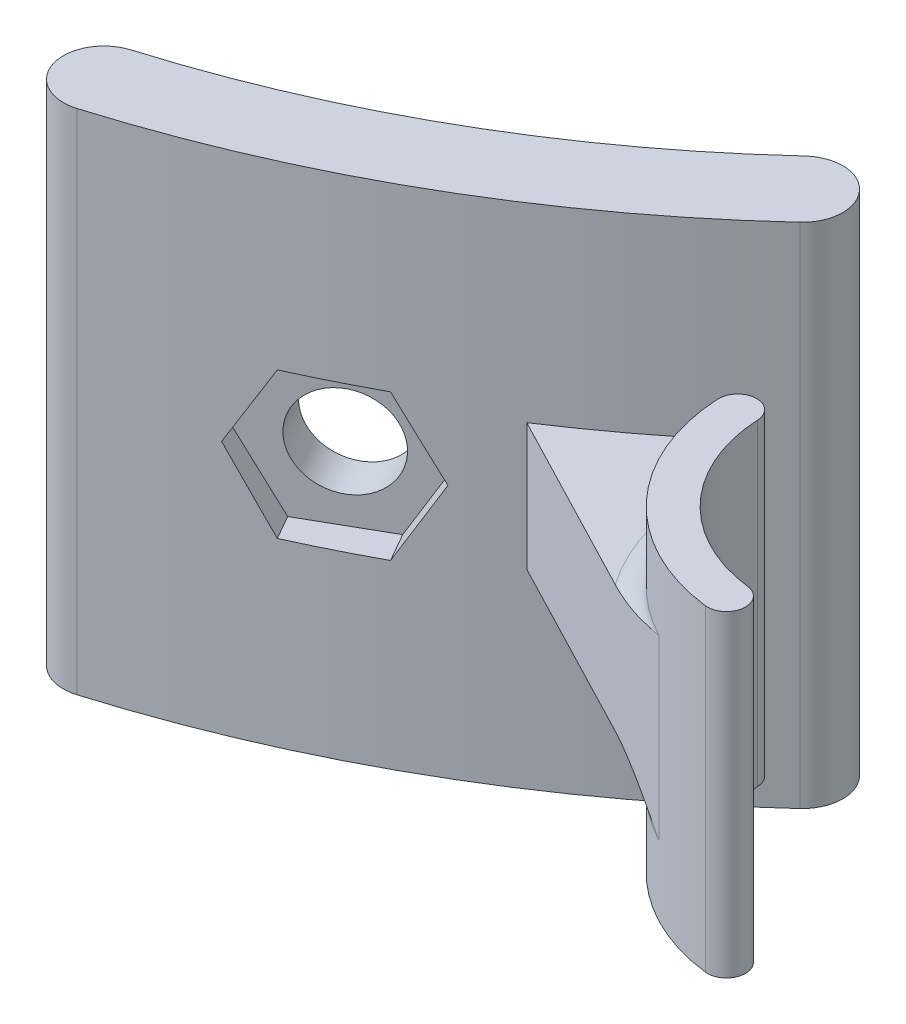
ISO-10303-21;
HEADER;
FILE_DESCRIPTION(('STEP AP214'),'2;1');
FILE_NAME('part.step','',(''),(''),'','','');
FILE_SCHEMA(('AUTOMOTIVE_DESIGN { 1 0 10303 214 1 1 1 1 }'));
ENDSEC;
DATA;
#1=APPLICATION_CONTEXT('core data for automotive mechanical design processes');
#2=APPLICATION_PROTOCOL_DEFINITION('international standard','automotive_design',2000,#1);
#3=PRODUCT_CONTEXT('',#1,'mechanical');
#4=PRODUCT('Part','Part','',(#3));
#5=PRODUCT_RELATED_PRODUCT_CATEGORY('part','',(#4));
#6=PRODUCT_DEFINITION_FORMATION('','',#4);
#7=PRODUCT_DEFINITION_CONTEXT('part definition',#1,'design');
#8=PRODUCT_DEFINITION('design','',#6,#7);
#9=PRODUCT_DEFINITION_SHAPE('','',#8);
#10=(LENGTH_UNIT() NAMED_UNIT(*) SI_UNIT(.MILLI.,.METRE.));
#11=(NAMED_UNIT(*) PLANE_ANGLE_UNIT() SI_UNIT($,.RADIAN.));
#12=(NAMED_UNIT(*) SI_UNIT($,.STERADIAN.) SOLID_ANGLE_UNIT());
#13=UNCERTAINTY_MEASURE_WITH_UNIT(LENGTH_MEASURE(1.E-05),#10,'distance_accuracy_value','');
#14=(GEOMETRIC_REPRESENTATION_CONTEXT(3) GLOBAL_UNCERTAINTY_ASSIGNED_CONTEXT((#13)) GLOBAL_UNIT_ASSIGNED_CONTEXT((#10,
#11,#12)) REPRESENTATION_CONTEXT('',''));
#15=CARTESIAN_POINT('',(0.,0.,0.));
#16=DIRECTION('',(0.,0.,1.));
#17=DIRECTION('',(1.,0.,0.));
#18=AXIS2_PLACEMENT_3D('',#15,#16,#17);
#19=CARTESIAN_POINT('',(-30.509171364313,2.5,-33.0785498875477));
#20=DIRECTION('',(0.,-1.,0.));
#21=DIRECTION('',(0.,0.,-1.));
#22=AXIS2_PLACEMENT_3D('',#19,#20,#21);
#23=CYLINDRICAL_SURFACE('',#22,46.6);
#24=CARTESIAN_POINT('',(-30.509171364313,-2.5,-33.0785498875477));
#25=DIRECTION('',(0.,1.,0.));
#26=DIRECTION('',(0.,0.,1.));
#27=AXIS2_PLACEMENT_3D('',#24,#25,#26);
#28=CIRCLE('',#27,46.6);
#29=CARTESIAN_POINT('',(-4.95492535241667,-2.5,5.88990544190407));
#30=VERTEX_POINT('',#29);
#31=CARTESIAN_POINT('',(-1.31541386396927,-2.5,3.24340659900628));
#32=VERTEX_POINT('',#31);
#33=EDGE_CURVE('E163',#30,#32,#28,.T.);
#34=ORIENTED_EDGE('',*,*,#33,.F.);
#35=DIRECTION('',(0.,-1.,0.));
#36=VECTOR('',#35,1.);
#37=CARTESIAN_POINT('',(-4.95492535241667,2.5,5.88990544190407));
#38=LINE('',#37,#36);
#39=CARTESIAN_POINT('',(-4.95492535241667,2.5,5.88990544190407));
#40=VERTEX_POINT('',#39);
#41=EDGE_CURVE('E190',#40,#30,#38,.T.);
#42=ORIENTED_EDGE('',*,*,#41,.F.);
#43=CARTESIAN_POINT('',(-30.509171364313,2.5,-33.0785498875477));
#44=DIRECTION('',(0.,1.,0.));
#45=DIRECTION('',(0.,0.,1.));
#46=AXIS2_PLACEMENT_3D('',#43,#44,#45);
#47=CIRCLE('',#46,46.6);
#48=CARTESIAN_POINT('',(-1.31541386396927,2.5,3.24340659900628));
#49=VERTEX_POINT('',#48);
#50=EDGE_CURVE('E172',#40,#49,#47,.T.);
#51=ORIENTED_EDGE('',*,*,#50,.T.);
#52=DIRECTION('',(0.,-1.,0.));
#53=VECTOR('',#52,1.);
#54=CARTESIAN_POINT('',(-1.31541386396927,2.5,3.24340659900628));
#55=LINE('',#54,#53);
#56=EDGE_CURVE('E179',#49,#32,#55,.T.);
#57=ORIENTED_EDGE('',*,*,#56,.T.);
#58=EDGE_LOOP('',(#34,#42,#51,#57));
#59=FACE_BOUND('',#58,.T.);
#60=ADVANCED_FACE('F53',(#59),#23,.F.);
#61=CARTESIAN_POINT('',(-3.46808472731264,2.5,6.66372076864122));
#62=DIRECTION('',(0.461661813000688,0.,-0.887056013122575));
#63=DIRECTION('',(-0.887056013122575,0.,-0.461661813000688));
#64=AXIS2_PLACEMENT_3D('',#61,#62,#63);
#65=PLANE('',#64);
#66=DIRECTION('',(0.887056013122575,0.,0.461661813000688));
#67=VECTOR('',#66,1.);
#68=CARTESIAN_POINT('',(-3.46808472731264,-2.5,6.66372076864122));
#69=LINE('',#68,#67);
#70=CARTESIAN_POINT('',(2.30926480051892,-2.5,9.67050006769415));
#71=VERTEX_POINT('',#70);
#72=EDGE_CURVE('E166',#30,#71,#69,.T.);
#73=ORIENTED_EDGE('',*,*,#72,.T.);
#74=CARTESIAN_POINT('',(2.30926480051892,-2.5,9.67050006769415));
#75=CARTESIAN_POINT('',(2.38446058593205,-2.50001837688627,9.70963516413709));
#76=CARTESIAN_POINT('',(2.4596302429623,-2.50232187536657,9.74875666225429));
#77=CARTESIAN_POINT('',(2.60974644292937,-2.51095613415451,9.82688354039089));
#78=CARTESIAN_POINT('',(2.68469309165984,-2.51728450788169,9.86588897546983));
#79=CARTESIAN_POINT('',(2.83408960180783,-2.5334060975854,9.9436412963048));
#80=CARTESIAN_POINT('',(2.90854024493343,-2.54319036775228,9.98238858889508));
#81=CARTESIAN_POINT('',(3.05708520343915,-2.56579883127198,10.0596977259071));
#82=CARTESIAN_POINT('',(3.13117945763898,-2.5786235288098,10.0982595384881));
#83=CARTESIAN_POINT('',(3.35167984273553,-2.62085252524169,10.213017350898));
#84=CARTESIAN_POINT('',(3.49750157335206,-2.65415390542921,10.2889092038762));
#85=CARTESIAN_POINT('',(3.78758687645834,-2.72878036237986,10.4398819778338));
#86=CARTESIAN_POINT('',(3.93184921054237,-2.77011138323481,10.5149622542941));
#87=CARTESIAN_POINT('',(4.22955602417046,-2.86213080868171,10.6699015876496));
#88=CARTESIAN_POINT('',(4.38288566339094,-2.9132864762573,10.7497008767385));
#89=CARTESIAN_POINT('',(4.68817673088018,-3.02056814547403,10.9085873795354));
#90=CARTESIAN_POINT('',(4.84013795197886,-3.0766948862178,10.9876744854232));
#91=CARTESIAN_POINT('',(5.29499036796341,-3.2500150715625,11.2243990979671));
#92=CARTESIAN_POINT('',(5.59642363298214,-3.37200568296961,11.3812778356889));
#93=CARTESIAN_POINT('',(5.9027042362641,-3.4960318860474,11.5406793351505));
#94=CARTESIAN_POINT('',(5.90760380065256,-3.49801594983036,11.5432292775949));
#95=CARTESIAN_POINT('',(5.91250335935445,-3.5,11.5457792170799));
#96=B_SPLINE_CURVE_WITH_KNOTS('',3,(#74,#75,#76,#77,#78,#79,#80,#81,#82,#83,#84,#85,#86,#87,#88,
#89,#90,#91,#92,#93,#94,#95),.UNSPECIFIED.,.F.,.F.,(4,2,2,2,2,2,2,2,2,2,4),(0.,0.25423729056324,
0.50832396955667,0.761757691786973,1.01523346960869,1.51811934572024,2.02137892085711,
2.56205838155762,3.10281836624157,4.18584231299607,4.20344912985776),.UNSPECIFIED.);
#97=CARTESIAN_POINT('',(5.91250335935445,-3.5,11.5457792170799));
#98=VERTEX_POINT('',#97);
#99=EDGE_CURVE('E202',#71,#98,#96,.T.);
#100=ORIENTED_EDGE('',*,*,#99,.T.);
#101=DIRECTION('',(0.,-1.,0.));
#102=VECTOR('',#101,1.);
#103=CARTESIAN_POINT('',(5.91250335935445,2.5,11.5457792170799));
#104=LINE('',#103,#102);
#105=CARTESIAN_POINT('',(5.91250335935445,3.5,11.5457792170799));
#106=VERTEX_POINT('',#105);
#107=EDGE_CURVE('E188',#106,#98,#104,.T.);
#108=ORIENTED_EDGE('',*,*,#107,.F.);
#109=CARTESIAN_POINT('',(2.30926480051892,2.5,9.67050006769415));
#110=CARTESIAN_POINT('',(2.38446058593205,2.50001837688627,9.70963516413709));
#111=CARTESIAN_POINT('',(2.4596302429623,2.50232187536657,9.74875666225429));
#112=CARTESIAN_POINT('',(2.60974644292937,2.51095613415452,9.82688354039089));
#113=CARTESIAN_POINT('',(2.68469309165984,2.51728450788169,9.86588897546983));
#114=CARTESIAN_POINT('',(2.83408960180783,2.5334060975854,9.9436412963048));
#115=CARTESIAN_POINT('',(2.90854024493343,2.54319036775229,9.98238858889508));
#116=CARTESIAN_POINT('',(3.05708520343915,2.56579883127198,10.0596977259071));
#117=CARTESIAN_POINT('',(3.13117945763898,2.5786235288098,10.0982595384881));
#118=CARTESIAN_POINT('',(3.35167984273553,2.62085252524169,10.213017350898));
#119=CARTESIAN_POINT('',(3.49750157335206,2.65415390542921,10.2889092038762));
#120=CARTESIAN_POINT('',(3.78758687645834,2.72878036237986,10.4398819778338));
#121=CARTESIAN_POINT('',(3.93184921054237,2.77011138323482,10.5149622542941));
#122=CARTESIAN_POINT('',(4.22955602417046,2.86213080868171,10.6699015876496));
#123=CARTESIAN_POINT('',(4.38288566339094,2.9132864762573,10.7497008767385));
#124=CARTESIAN_POINT('',(4.68817673088018,3.02056814547403,10.9085873795354));
#125=CARTESIAN_POINT('',(4.84013795197886,3.0766948862178,10.9876744854232));
#126=CARTESIAN_POINT('',(5.29499036796341,3.2500150715625,11.2243990979671));
#127=CARTESIAN_POINT('',(5.59642363298214,3.37200568296961,11.3812778356889));
#128=CARTESIAN_POINT('',(5.9027042362641,3.4960318860474,11.5406793351505));
#129=CARTESIAN_POINT('',(5.90760380065256,3.49801594983036,11.5432292775949));
#130=CARTESIAN_POINT('',(5.91250335935445,3.5,11.5457792170799));
#131=B_SPLINE_CURVE_WITH_KNOTS('',3,(#109,#110,#111,#112,#113,#114,#115,#116,#117,#118,#119,
#120,#121,#122,#123,#124,#125,#126,#127,#128,#129,#130),.UNSPECIFIED.,.F.,.F.,(4,2,2,2,2,2,2,2,
2,2,4),(0.,0.25423729056324,0.50832396955667,0.761757691786973,1.01523346960869,
1.51811934572024,2.02137892085711,2.56205838155762,3.10281836624157,4.18584231299607,
4.20344912985776),.UNSPECIFIED.);
#132=CARTESIAN_POINT('',(2.30926480051892,2.5,9.67050006769415));
#133=VERTEX_POINT('',#132);
#134=EDGE_CURVE('E67',#106,#133,#131,.F.);
#135=ORIENTED_EDGE('',*,*,#134,.T.);
#136=DIRECTION('',(0.887056013122575,0.,0.461661813000688));
#137=VECTOR('',#136,1.);
#138=CARTESIAN_POINT('',(-3.46808472731264,2.5,6.66372076864122));
#139=LINE('',#138,#137);
#140=EDGE_CURVE('E175',#40,#133,#139,.T.);
#141=ORIENTED_EDGE('',*,*,#140,.F.);
#142=ORIENTED_EDGE('',*,*,#41,.T.);
#143=EDGE_LOOP('',(#73,#100,#108,#135,#141,#142));
#144=FACE_BOUND('',#143,.T.);
#145=ADVANCED_FACE('F215',(#144),#65,.F.);
#146=CARTESIAN_POINT('',(-2.09464008218954,2.5,2.62056421166369));
#147=DIRECTION('',(0.624365781945273,0.,-0.781132108119918));
#148=DIRECTION('',(-0.781132108119918,0.,-0.624365781945273));
#149=AXIS2_PLACEMENT_3D('',#146,#147,#148);
#150=PLANE('',#149);
#151=DIRECTION('',(0.781132108119918,0.,0.624365781945273));
#152=VECTOR('',#151,1.);
#153=CARTESIAN_POINT('',(-2.09464008218954,-2.5,2.62056421166369));
#154=LINE('',#153,#152);
#155=CARTESIAN_POINT('',(0.743090829104949,-2.5,4.88878755181687));
#156=VERTEX_POINT('',#155);
#157=EDGE_CURVE('E176',#32,#156,#154,.T.);
#158=ORIENTED_EDGE('',*,*,#157,.F.);
#159=ORIENTED_EDGE('',*,*,#56,.F.);
#160=DIRECTION('',(0.781132108119918,0.,0.624365781945273));
#161=VECTOR('',#160,1.);
#162=CARTESIAN_POINT('',(-2.09464008218954,2.5,2.62056421166369));
#163=LINE('',#162,#161);
#164=CARTESIAN_POINT('',(0.743090829104949,2.5,4.88878755181687));
#165=VERTEX_POINT('',#164);
#166=EDGE_CURVE('E178',#49,#165,#163,.T.);
#167=ORIENTED_EDGE('',*,*,#166,.T.);
#168=CARTESIAN_POINT('',(0.743090829104949,2.5,4.88878755181687));
#169=CARTESIAN_POINT('',(0.775942075628037,2.50000476532143,4.91504584284095));
#170=CARTESIAN_POINT('',(0.808779704519515,2.50155414872608,4.941293249172));
#171=CARTESIAN_POINT('',(0.874279790475666,2.507696842513,4.9936480454483));
#172=CARTESIAN_POINT('',(0.906942254343171,2.51229003380806,5.01975544083111));
#173=CARTESIAN_POINT('',(1.00508801787931,2.53068735249807,5.09820421506259));
#174=CARTESIAN_POINT('',(1.07007787741382,2.54910793135427,5.15015118286096));
#175=CARTESIAN_POINT('',(1.20714014349413,2.60186493502541,5.25970626073683));
#176=CARTESIAN_POINT('',(1.27873875092447,2.63823369733831,5.31693565900345));
#177=CARTESIAN_POINT('',(1.41516827088333,2.72758547129146,5.42598497732497));
#178=CARTESIAN_POINT('',(1.48002846731379,2.78049220952966,5.47782830426092));
#179=CARTESIAN_POINT('',(1.57247470065199,2.87670629606292,5.55172139374745));
#180=CARTESIAN_POINT('',(1.60390452856969,2.91399480843073,5.57684353234634));
#181=CARTESIAN_POINT('',(1.66202981305783,2.99423177464444,5.62330358477919));
#182=CARTESIAN_POINT('',(1.68873156254848,3.03717257065106,5.64464652859975));
#183=CARTESIAN_POINT('',(1.73131260774257,3.11980412489685,5.6786819334977));
#184=CARTESIAN_POINT('',(1.7482839369887,3.15856791310686,5.69224726661519));
#185=CARTESIAN_POINT('',(1.77700451345132,3.23911251836738,5.7152038766362));
#186=CARTESIAN_POINT('',(1.78876613881088,3.28088590684125,5.72460504749863));
#187=CARTESIAN_POINT('',(1.80329638599487,3.35238280567023,5.7362192021987));
#188=CARTESIAN_POINT('',(1.80775021408636,3.3815540604266,5.73977918626553));
#189=CARTESIAN_POINT('',(1.81374437195358,3.44047228672119,5.74457036950453));
#190=CARTESIAN_POINT('',(1.81527560256983,3.47022076593463,5.7457942956383));
#191=CARTESIAN_POINT('',(1.81525673807331,3.5,5.74577921707988));
#192=B_SPLINE_CURVE_WITH_KNOTS('',3,(#168,#169,#170,#171,#172,#173,#174,#175,#176,#177,#178,
#179,#180,#181,#182,#183,#184,#185,#186,#187,#188,#189,#190,#191),.UNSPECIFIED.,.F.,.F.,(4,2,2,
2,2,2,2,2,2,2,2,4),(0.,0.126106513100755,0.252208092649019,0.506890994992005,0.801248067632327,
1.09426710726273,1.25835917294153,1.42223116829724,1.5550388859299,1.68752934013549,
1.77647276544468,1.86569265668328),.UNSPECIFIED.);
#193=CARTESIAN_POINT('',(1.81525673807331,3.5,5.74577921707988));
#194=VERTEX_POINT('',#193);
#195=EDGE_CURVE('E12',#165,#194,#192,.T.);
#196=ORIENTED_EDGE('',*,*,#195,.T.);
#197=DIRECTION('',(0.,-1.,0.));
#198=VECTOR('',#197,1.);
#199=CARTESIAN_POINT('',(1.81525673807331,2.5,5.74577921707988));
#200=LINE('',#199,#198);
#201=CARTESIAN_POINT('',(1.81525673807331,-3.5,5.74577921707988));
#202=VERTEX_POINT('',#201);
#203=EDGE_CURVE('E186',#194,#202,#200,.T.);
#204=ORIENTED_EDGE('',*,*,#203,.T.);
#205=CARTESIAN_POINT('',(1.81525673807331,-3.5,5.74577921707988));
#206=CARTESIAN_POINT('',(1.81526107453023,-3.47766865574741,5.74578268324813));
#207=CARTESIAN_POINT('',(1.81440545648937,-3.45535199285952,5.74509878020334));
#208=CARTESIAN_POINT('',(1.81102199718758,-3.41094875050862,5.7423943513485));
#209=CARTESIAN_POINT('',(1.80849579079124,-3.38886196752417,5.74037513230014));
#210=CARTESIAN_POINT('',(1.79855101139805,-3.32364629322558,5.73242618243934));
#211=CARTESIAN_POINT('',(1.78876401857282,-3.28108076655395,5.72460335277366));
#212=CARTESIAN_POINT('',(1.76373580279582,-3.19892167721145,5.70459807920743));
#213=CARTESIAN_POINT('',(1.7485140194439,-3.15931812286119,5.69243117355047));
#214=CARTESIAN_POINT('',(1.71358147126775,-3.08341191856962,5.66450927976244));
#215=CARTESIAN_POINT('',(1.69385868043285,-3.04711848312237,5.64874467913501));
#216=CARTESIAN_POINT('',(1.64088976435009,-2.96216738945364,5.6064061574368));
#217=CARTESIAN_POINT('',(1.60561484935412,-2.9155856687763,5.57821060683073));
#218=CARTESIAN_POINT('',(1.52974380797583,-2.83018731356315,5.51756621443573));
#219=CARTESIAN_POINT('',(1.48913685155437,-2.79138690050786,5.48510871610101));
#220=CARTESIAN_POINT('',(1.38901384743675,-2.70874290884276,5.4050795160377));
#221=CARTESIAN_POINT('',(1.32791912507029,-2.66803624642506,5.35624596572458));
#222=CARTESIAN_POINT('',(1.20143680148594,-2.59974272382967,5.25514752917833));
#223=CARTESIAN_POINT('',(1.1360455530042,-2.57216717859542,5.20287972765505));
#224=CARTESIAN_POINT('',(1.01598331522328,-2.53412836123418,5.10691292230299));
#225=CARTESIAN_POINT('',(0.961749403297153,-2.5213595298024,5.0635632782726));
#226=CARTESIAN_POINT('',(0.852711206364877,-2.50432862374228,4.97640808597948));
#227=CARTESIAN_POINT('',(0.797910401444464,-2.50003000639401,4.93260531937996));
#228=CARTESIAN_POINT('',(0.743090829104949,-2.5,4.88878755181687));
#229=B_SPLINE_CURVE_WITH_KNOTS('',3,(#205,#206,#207,#208,#209,#210,#211,#212,#213,#214,#215,
#216,#217,#218,#219,#220,#221,#222,#223,#224,#225,#226,#227,#228),.UNSPECIFIED.,.F.,.F.,(4,2,2,
2,2,2,2,2,2,2,2,4),(0.,0.0669397444869256,0.133814077414058,0.266142446850244,0.398002158758376,
0.530218392414761,0.723777409406529,0.917735832481692,1.18087105949847,1.44423261885746,
1.65551652110455,1.86588687599491),.UNSPECIFIED.);
#230=EDGE_CURVE('E210',#202,#156,#229,.T.);
#231=ORIENTED_EDGE('',*,*,#230,.T.);
#232=EDGE_LOOP('',(#158,#159,#167,#196,#204,#231));
#233=FACE_BOUND('',#232,.T.);
#234=ADVANCED_FACE('F230',(#233),#150,.T.);
#235=CARTESIAN_POINT('',(0.,2.5,0.));
#236=DIRECTION('',(0.,1.,0.));
#237=DIRECTION('',(0.,0.,1.));
#238=AXIS2_PLACEMENT_3D('',#235,#236,#237);
#239=PLANE('',#238);
#240=ORIENTED_EDGE('',*,*,#140,.T.);
#241=CARTESIAN_POINT('',(9.49038241010978,2.5,4.67109511537993));
#242=DIRECTION('',(0.,1.,0.));
#243=DIRECTION('',(0.,0.,1.));
#244=AXIS2_PLACEMENT_3D('',#241,#242,#243);
#245=CIRCLE('',#244,8.74999999999999);
#246=EDGE_CURVE('E74',#133,#165,#245,.F.);
#247=ORIENTED_EDGE('',*,*,#246,.T.);
#248=ORIENTED_EDGE('',*,*,#166,.F.);
#249=ORIENTED_EDGE('',*,*,#50,.F.);
#250=EDGE_LOOP('',(#240,#247,#248,#249));
#251=FACE_BOUND('',#250,.T.);
#252=ADVANCED_FACE('F245',(#251),#239,.T.);
#253=CARTESIAN_POINT('',(0.,-2.5,0.));
#254=DIRECTION('',(0.,1.,0.));
#255=DIRECTION('',(0.,0.,1.));
#256=AXIS2_PLACEMENT_3D('',#253,#254,#255);
#257=PLANE('',#256);
#258=ORIENTED_EDGE('',*,*,#157,.T.);
#259=CARTESIAN_POINT('',(9.49038241010978,-2.5,4.67109511537993));
#260=DIRECTION('',(0.,1.,0.));
#261=DIRECTION('',(0.,0.,1.));
#262=AXIS2_PLACEMENT_3D('',#259,#260,#261);
#263=CIRCLE('',#262,8.74999999999999);
#264=EDGE_CURVE('E192',#156,#71,#263,.T.);
#265=ORIENTED_EDGE('',*,*,#264,.T.);
#266=ORIENTED_EDGE('',*,*,#72,.F.);
#267=ORIENTED_EDGE('',*,*,#33,.T.);
#268=EDGE_LOOP('',(#258,#265,#266,#267));
#269=FACE_BOUND('',#268,.T.);
#270=ADVANCED_FACE('F235',(#269),#257,.F.);
#271=CARTESIAN_POINT('',(9.49038241010978,6.25,4.67109511537993));
#272=DIRECTION('',(0.,-1.,0.));
#273=DIRECTION('',(0.,0.,-1.));
#274=AXIS2_PLACEMENT_3D('',#271,#272,#273);
#275=CYLINDRICAL_SURFACE('',#274,7.74999999999999);
#276=ORIENTED_EDGE('',*,*,#107,.T.);
#277=CARTESIAN_POINT('',(9.49038241010978,-3.5,4.67109511537993));
#278=DIRECTION('',(0.,1.,0.));
#279=DIRECTION('',(0.,0.,1.));
#280=AXIS2_PLACEMENT_3D('',#277,#278,#279);
#281=CIRCLE('',#280,7.74999999999999);
#282=EDGE_CURVE('E198',#98,#202,#281,.F.);
#283=ORIENTED_EDGE('',*,*,#282,.T.);
#284=ORIENTED_EDGE('',*,*,#203,.F.);
#285=CARTESIAN_POINT('',(9.49038241010978,3.5,4.67109511537993));
#286=DIRECTION('',(0.,1.,0.));
#287=DIRECTION('',(0.,0.,1.));
#288=AXIS2_PLACEMENT_3D('',#285,#286,#287);
#289=CIRCLE('',#288,7.74999999999999);
#290=EDGE_CURVE('E195',#194,#106,#289,.T.);
#291=ORIENTED_EDGE('',*,*,#290,.T.);
#292=EDGE_LOOP('',(#276,#283,#284,#291));
#293=FACE_BOUND('',#292,.T.);
#294=CARTESIAN_POINT('',(9.49038241010978,-6.25,4.67109511537993));
#295=DIRECTION('',(0.,1.,0.));
#296=DIRECTION('',(0.,0.,1.));
#297=AXIS2_PLACEMENT_3D('',#294,#295,#296);
#298=CIRCLE('',#297,7.74999999999999);
#299=CARTESIAN_POINT('',(1.75103045605968,-6.25,5.07721250153921));
#300=VERTEX_POINT('',#299);
#301=CARTESIAN_POINT('',(8.5478021117941,-6.25,12.3635617146722));
#302=VERTEX_POINT('',#301);
#303=EDGE_CURVE('E162',#300,#302,#298,.T.);
#304=ORIENTED_EDGE('',*,*,#303,.T.);
#305=DIRECTION('',(0.,-1.,0.));
#306=VECTOR('',#305,1.);
#307=CARTESIAN_POINT('',(8.5478021117941,6.25,12.3635617146722));
#308=LINE('',#307,#306);
#309=CARTESIAN_POINT('',(8.5478021117941,6.25,12.3635617146722));
#310=VERTEX_POINT('',#309);
#311=EDGE_CURVE('E142',#310,#302,#308,.T.);
#312=ORIENTED_EDGE('',*,*,#311,.F.);
#313=CARTESIAN_POINT('',(9.49038241010978,6.25,4.67109511537993));
#314=DIRECTION('',(0.,1.,0.));
#315=DIRECTION('',(0.,0.,1.));
#316=AXIS2_PLACEMENT_3D('',#313,#314,#315);
#317=CIRCLE('',#316,7.74999999999999);
#318=CARTESIAN_POINT('',(1.75103045605968,6.25,5.07721250153921));
#319=VERTEX_POINT('',#318);
#320=EDGE_CURVE('E149',#319,#310,#317,.T.);
#321=ORIENTED_EDGE('',*,*,#320,.F.);
#322=DIRECTION('',(0.,-1.,0.));
#323=VECTOR('',#322,1.);
#324=CARTESIAN_POINT('',(1.75103045605968,6.25,5.07721250153921));
#325=LINE('',#324,#323);
#326=EDGE_CURVE('E352',#319,#300,#325,.T.);
#327=ORIENTED_EDGE('',*,*,#326,.T.);
#328=EDGE_LOOP('',(#304,#312,#321,#327));
#329=FACE_BOUND('',#328,.T.);
#330=ADVANCED_FACE('F160',(#293,#329),#275,.T.);
#331=CARTESIAN_POINT('',(8.63901956001819,6.25,11.6191294631278));
#332=DIRECTION('',(0.,-1.,0.));
#333=DIRECTION('',(0.,0.,-1.));
#334=AXIS2_PLACEMENT_3D('',#331,#332,#333);
#335=CYLINDRICAL_SURFACE('',#334,0.749999999999997);
#336=CARTESIAN_POINT('',(8.63901956001819,-6.25,11.6191294631278));
#337=DIRECTION('',(0.,1.,0.));
#338=DIRECTION('',(0.,0.,1.));
#339=AXIS2_PLACEMENT_3D('',#336,#337,#338);
#340=CIRCLE('',#339,0.749999999999997);
#341=CARTESIAN_POINT('',(8.73023700824229,-6.25,10.8746972115834));
#342=VERTEX_POINT('',#341);
#343=EDGE_CURVE('E343',#302,#342,#340,.T.);
#344=ORIENTED_EDGE('',*,*,#343,.T.);
#345=DIRECTION('',(0.,-1.,0.));
#346=VECTOR('',#345,1.);
#347=CARTESIAN_POINT('',(8.73023700824229,6.25,10.8746972115834));
#348=LINE('',#347,#346);
#349=CARTESIAN_POINT('',(8.73023700824229,6.25,10.8746972115834));
#350=VERTEX_POINT('',#349);
#351=EDGE_CURVE('E144',#350,#342,#348,.T.);
#352=ORIENTED_EDGE('',*,*,#351,.F.);
#353=CARTESIAN_POINT('',(8.63901956001819,6.25,11.6191294631278));
#354=DIRECTION('',(0.,1.,0.));
#355=DIRECTION('',(0.,0.,1.));
#356=AXIS2_PLACEMENT_3D('',#353,#354,#355);
#357=CIRCLE('',#356,0.749999999999997);
#358=EDGE_CURVE('E137',#310,#350,#357,.T.);
#359=ORIENTED_EDGE('',*,*,#358,.F.);
#360=ORIENTED_EDGE('',*,*,#311,.T.);
#361=EDGE_LOOP('',(#344,#352,#359,#360));
#362=FACE_BOUND('',#361,.T.);
#363=ADVANCED_FACE('F140',(#362),#335,.T.);
#364=CARTESIAN_POINT('',(9.49038241010978,6.25,4.67109511537993));
#365=DIRECTION('',(0.,-1.,0.));
#366=DIRECTION('',(0.,0.,-1.));
#367=AXIS2_PLACEMENT_3D('',#364,#365,#366);
#368=CYLINDRICAL_SURFACE('',#367,6.25);
#369=CARTESIAN_POINT('',(9.49038241010978,-6.25,4.67109511537993));
#370=DIRECTION('',(0.,1.,0.));
#371=DIRECTION('',(0.,0.,1.));
#372=AXIS2_PLACEMENT_3D('',#369,#370,#371);
#373=CIRCLE('',#372,6.25);
#374=CARTESIAN_POINT('',(3.24896954394034,-6.25,4.99860913647612));
#375=VERTEX_POINT('',#374);
#376=EDGE_CURVE('E345',#375,#342,#373,.T.);
#377=ORIENTED_EDGE('',*,*,#376,.F.);
#378=DIRECTION('',(0.,-1.,0.));
#379=VECTOR('',#378,1.);
#380=CARTESIAN_POINT('',(3.24896954394034,6.25,4.99860913647612));
#381=LINE('',#380,#379);
#382=CARTESIAN_POINT('',(3.24896954394034,6.25,4.99860913647612));
#383=VERTEX_POINT('',#382);
#384=EDGE_CURVE('E168',#383,#375,#381,.T.);
#385=ORIENTED_EDGE('',*,*,#384,.F.);
#386=CARTESIAN_POINT('',(9.49038241010978,6.25,4.67109511537993));
#387=DIRECTION('',(0.,1.,0.));
#388=DIRECTION('',(0.,0.,1.));
#389=AXIS2_PLACEMENT_3D('',#386,#387,#388);
#390=CIRCLE('',#389,6.25);
#391=EDGE_CURVE('E148',#383,#350,#390,.T.);
#392=ORIENTED_EDGE('',*,*,#391,.T.);
#393=ORIENTED_EDGE('',*,*,#351,.T.);
#394=EDGE_LOOP('',(#377,#385,#392,#393));
#395=FACE_BOUND('',#394,.T.);
#396=ADVANCED_FACE('F255',(#395),#368,.F.);
#397=CARTESIAN_POINT('',(2.5,6.25,5.03791081900767));
#398=DIRECTION('',(0.,-1.,0.));
#399=DIRECTION('',(0.,0.,-1.));
#400=AXIS2_PLACEMENT_3D('',#397,#398,#399);
#401=CYLINDRICAL_SURFACE('',#400,0.749999999999997);
#402=CARTESIAN_POINT('',(2.5,-6.25,5.03791081900767));
#403=DIRECTION('',(0.,1.,0.));
#404=DIRECTION('',(0.,0.,1.));
#405=AXIS2_PLACEMENT_3D('',#402,#403,#404);
#406=CIRCLE('',#405,0.749999999999997);
#407=EDGE_CURVE('E158',#375,#300,#406,.T.);
#408=ORIENTED_EDGE('',*,*,#407,.T.);
#409=ORIENTED_EDGE('',*,*,#326,.F.);
#410=CARTESIAN_POINT('',(2.5,6.25,5.03791081900767));
#411=DIRECTION('',(0.,1.,0.));
#412=DIRECTION('',(0.,0.,1.));
#413=AXIS2_PLACEMENT_3D('',#410,#411,#412);
#414=CIRCLE('',#413,0.749999999999997);
#415=EDGE_CURVE('E154',#383,#319,#414,.T.);
#416=ORIENTED_EDGE('',*,*,#415,.F.);
#417=ORIENTED_EDGE('',*,*,#384,.T.);
#418=EDGE_LOOP('',(#408,#409,#416,#417));
#419=FACE_BOUND('',#418,.T.);
#420=ADVANCED_FACE('F299',(#419),#401,.T.);
#421=CARTESIAN_POINT('',(0.,6.25,0.));
#422=DIRECTION('',(0.,1.,0.));
#423=DIRECTION('',(0.,0.,1.));
#424=AXIS2_PLACEMENT_3D('',#421,#422,#423);
#425=PLANE('',#424);
#426=ORIENTED_EDGE('',*,*,#320,.T.);
#427=ORIENTED_EDGE('',*,*,#358,.T.);
#428=ORIENTED_EDGE('',*,*,#391,.F.);
#429=ORIENTED_EDGE('',*,*,#415,.T.);
#430=EDGE_LOOP('',(#426,#427,#428,#429));
#431=FACE_BOUND('',#430,.T.);
#432=ADVANCED_FACE('F152',(#431),#425,.T.);
#433=CARTESIAN_POINT('',(0.,-6.25,0.));
#434=DIRECTION('',(0.,1.,0.));
#435=DIRECTION('',(0.,0.,1.));
#436=AXIS2_PLACEMENT_3D('',#433,#434,#435);
#437=PLANE('',#436);
#438=ORIENTED_EDGE('',*,*,#303,.F.);
#439=ORIENTED_EDGE('',*,*,#407,.F.);
#440=ORIENTED_EDGE('',*,*,#376,.T.);
#441=ORIENTED_EDGE('',*,*,#343,.F.);
#442=EDGE_LOOP('',(#438,#439,#440,#441));
#443=FACE_BOUND('',#442,.T.);
#444=ADVANCED_FACE('F221',(#443),#437,.F.);
#445=CARTESIAN_POINT('',(9.49038241010978,-3.5,4.67109511537993));
#446=DIRECTION('',(0.,1.,0.));
#447=DIRECTION('',(0.,0.,1.));
#448=AXIS2_PLACEMENT_3D('',#445,#446,#447);
#449=TOROIDAL_SURFACE('',#448,8.74999999999999,1.);
#450=ORIENTED_EDGE('',*,*,#230,.F.);
#451=ORIENTED_EDGE('',*,*,#282,.F.);
#452=ORIENTED_EDGE('',*,*,#99,.F.);
#453=ORIENTED_EDGE('',*,*,#264,.F.);
#454=EDGE_LOOP('',(#450,#451,#452,#453));
#455=FACE_BOUND('',#454,.T.);
#456=ADVANCED_FACE('F218',(#455),#449,.F.);
#457=CARTESIAN_POINT('',(9.49038241010978,3.5,4.67109511537993));
#458=DIRECTION('',(0.,1.,0.));
#459=DIRECTION('',(0.,0.,1.));
#460=AXIS2_PLACEMENT_3D('',#457,#458,#459);
#461=TOROIDAL_SURFACE('',#460,8.74999999999999,1.);
#462=ORIENTED_EDGE('',*,*,#195,.F.);
#463=ORIENTED_EDGE('',*,*,#246,.F.);
#464=ORIENTED_EDGE('',*,*,#134,.F.);
#465=ORIENTED_EDGE('',*,*,#290,.F.);
#466=EDGE_LOOP('',(#462,#463,#464,#465));
#467=FACE_BOUND('',#466,.T.);
#468=ADVANCED_FACE('F55',(#467),#461,.F.);
#469=CLOSED_SHELL('',(#60,#145,#234,#252,#270,#330,#363,#396,#420,#432,#444,#456,#468));
#470=MANIFOLD_SOLID_BREP('B2',#469);
#471=CARTESIAN_POINT('',(-17.5,10.,10.));
#472=DIRECTION('',(0.,-1.,0.));
#473=DIRECTION('',(0.,0.,-1.));
#474=AXIS2_PLACEMENT_3D('',#471,#472,#473);
#475=CYLINDRICAL_SURFACE('',#474,1.6);
#476=CARTESIAN_POINT('',(-17.5,-10.,10.));
#477=DIRECTION('',(0.,1.,0.));
#478=DIRECTION('',(0.,0.,1.));
#479=AXIS2_PLACEMENT_3D('',#476,#477,#478);
#480=CIRCLE('',#479,1.6);
#481=CARTESIAN_POINT('',(-17.9625483151756,-10.,8.46831822622052));
#482=VERTEX_POINT('',#481);
#483=CARTESIAN_POINT('',(-17.0374516848244,-10.,11.5316817737795));
#484=VERTEX_POINT('',#483);
#485=EDGE_CURVE('E507',#482,#484,#480,.T.);
#486=ORIENTED_EDGE('',*,*,#485,.T.);
#487=DIRECTION('',(0.,-1.,0.));
#488=VECTOR('',#487,1.);
#489=CARTESIAN_POINT('',(-17.0374516848244,10.,11.5316817737795));
#490=LINE('',#489,#488);
#491=CARTESIAN_POINT('',(-17.0374516848244,10.,11.5316817737795));
#492=VERTEX_POINT('',#491);
#493=EDGE_CURVE('E522',#492,#484,#490,.T.);
#494=ORIENTED_EDGE('',*,*,#493,.F.);
#495=CARTESIAN_POINT('',(-17.5,10.,10.));
#496=DIRECTION('',(0.,1.,0.));
#497=DIRECTION('',(0.,0.,1.));
#498=AXIS2_PLACEMENT_3D('',#495,#496,#497);
#499=CIRCLE('',#498,1.6);
#500=CARTESIAN_POINT('',(-17.9625483151756,10.,8.46831822622052));
#501=VERTEX_POINT('',#500);
#502=EDGE_CURVE('E499',#501,#492,#499,.T.);
#503=ORIENTED_EDGE('',*,*,#502,.F.);
#504=DIRECTION('',(0.,-1.,0.));
#505=VECTOR('',#504,1.);
#506=CARTESIAN_POINT('',(-17.9625483151756,10.,8.46831822622052));
#507=LINE('',#506,#505);
#508=EDGE_CURVE('E391',#501,#482,#507,.T.);
#509=ORIENTED_EDGE('',*,*,#508,.T.);
#510=EDGE_LOOP('',(#486,#494,#503,#509));
#511=FACE_BOUND('',#510,.T.);
#512=ADVANCED_FACE('F368',(#511),#475,.T.);
#513=CARTESIAN_POINT('',(-30.509171364313,10.,-33.0785498875477));
#514=DIRECTION('',(0.,-1.,0.));
#515=DIRECTION('',(0.,0.,-1.));
#516=AXIS2_PLACEMENT_3D('',#513,#514,#515);
#517=CYLINDRICAL_SURFACE('',#516,46.6);
#518=CARTESIAN_POINT('',(-30.509171364313,1.03968848910518,-33.0785498875477));
#519=DIRECTION('',(0.751920617741405,0.5,-0.429668924423659));
#520=DIRECTION('',(0.43412157106223,-0.866025403784439,-0.248069469178417));
#521=AXIS2_PLACEMENT_3D('',#518,#519,#520);
#522=ELLIPSE('',#521,93.2,46.6);
#523=CARTESIAN_POINT('',(-8.31508035364605,2.875,7.89683692222175));
#524=VERTEX_POINT('',#523);
#525=CARTESIAN_POINT('',(-6.86983954852551,0.,7.08040915402973));
#526=VERTEX_POINT('',#525);
#527=EDGE_CURVE('E375',#524,#526,#522,.T.);
#528=ORIENTED_EDGE('',*,*,#527,.T.);
#529=CARTESIAN_POINT('',(-30.509171364313,-1.03968848910518,-33.0785498875477));
#530=DIRECTION('',(0.751920617741405,-0.5,-0.429668924423659));
#531=DIRECTION('',(-0.43412157106223,-0.866025403784439,0.248069469178417));
#532=AXIS2_PLACEMENT_3D('',#529,#530,#531);
#533=ELLIPSE('',#532,93.2,46.6);
#534=CARTESIAN_POINT('',(-8.31508035364605,-2.875,7.89683692222175));
#535=VERTEX_POINT('',#534);
#536=EDGE_CURVE('E51',#526,#535,#533,.T.);
#537=ORIENTED_EDGE('',*,*,#536,.T.);
#538=CARTESIAN_POINT('',(-30.509171364313,-2.875,-33.0785498875477));
#539=DIRECTION('',(0.,-1.,0.));
#540=DIRECTION('',(0.,0.,-1.));
#541=AXIS2_PLACEMENT_3D('',#538,#539,#540);
#542=CIRCLE('',#541,46.6);
#543=CARTESIAN_POINT('',(-11.2937883449283,-2.875,9.37529629178378));
#544=VERTEX_POINT('',#543);
#545=EDGE_CURVE('E456',#535,#544,#542,.T.);
#546=ORIENTED_EDGE('',*,*,#545,.T.);
#547=CARTESIAN_POINT('',(-30.509171364313,-10.4603115108948,-33.0785498875477));
#548=DIRECTION('',(-0.751920617741405,-0.5,0.429668924423659));
#549=DIRECTION('',(0.43412157106223,-0.866025403784439,-0.248069469178417));
#550=AXIS2_PLACEMENT_3D('',#547,#548,#549);
#551=ELLIPSE('',#550,93.2,46.6);
#552=CARTESIAN_POINT('',(-12.8276263106739,0.,10.0366790288819));
#553=VERTEX_POINT('',#552);
#554=EDGE_CURVE('E683',#544,#553,#551,.T.);
#555=ORIENTED_EDGE('',*,*,#554,.T.);
#556=CARTESIAN_POINT('',(-30.509171364313,10.4603115108948,-33.0785498875477));
#557=DIRECTION('',(-0.751920617741405,0.5,0.429668924423659));
#558=DIRECTION('',(-0.43412157106223,-0.866025403784439,0.248069469178417));
#559=AXIS2_PLACEMENT_3D('',#556,#557,#558);
#560=ELLIPSE('',#559,93.2,46.6);
#561=CARTESIAN_POINT('',(-11.2937883449283,2.875,9.37529629178376));
#562=VERTEX_POINT('',#561);
#563=EDGE_CURVE('E685',#553,#562,#560,.T.);
#564=ORIENTED_EDGE('',*,*,#563,.T.);
#565=CARTESIAN_POINT('',(-30.509171364313,2.875,-33.0785498875477));
#566=DIRECTION('',(0.,1.,0.));
#567=DIRECTION('',(0.,0.,1.));
#568=AXIS2_PLACEMENT_3D('',#565,#566,#567);
#569=CIRCLE('',#568,46.6);
#570=EDGE_CURVE('E690',#562,#524,#569,.T.);
#571=ORIENTED_EDGE('',*,*,#570,.T.);
#572=EDGE_LOOP('',(#528,#537,#546,#555,#564,#571));
#573=FACE_BOUND('',#572,.T.);
#574=CARTESIAN_POINT('',(-30.509171364313,-10.,-33.0785498875477));
#575=DIRECTION('',(0.,1.,0.));
#576=DIRECTION('',(0.,0.,1.));
#577=AXIS2_PLACEMENT_3D('',#574,#575,#576);
#578=CIRCLE('',#577,46.6);
#579=CARTESIAN_POINT('',(1.08477053739779,-10.,1.17612621822392));
#580=VERTEX_POINT('',#579);
#581=EDGE_CURVE('E509',#484,#580,#578,.T.);
#582=ORIENTED_EDGE('',*,*,#581,.T.);
#583=DIRECTION('',(0.,-1.,0.));
#584=VECTOR('',#583,1.);
#585=CARTESIAN_POINT('',(1.08477053739779,10.,1.17612621822392));
#586=LINE('',#585,#584);
#587=CARTESIAN_POINT('',(1.08477053739779,10.,1.17612621822392));
#588=VERTEX_POINT('',#587);
#589=EDGE_CURVE('E519',#588,#580,#586,.T.);
#590=ORIENTED_EDGE('',*,*,#589,.F.);
#591=CARTESIAN_POINT('',(-30.509171364313,10.,-33.0785498875477));
#592=DIRECTION('',(0.,1.,0.));
#593=DIRECTION('',(0.,0.,1.));
#594=AXIS2_PLACEMENT_3D('',#591,#592,#593);
#595=CIRCLE('',#594,46.6);
#596=EDGE_CURVE('E418',#492,#588,#595,.T.);
#597=ORIENTED_EDGE('',*,*,#596,.F.);
#598=ORIENTED_EDGE('',*,*,#493,.T.);
#599=EDGE_LOOP('',(#582,#590,#597,#598));
#600=FACE_BOUND('',#599,.T.);
#601=ADVANCED_FACE('F557',(#573,#600),#517,.T.);
#602=CARTESIAN_POINT('',(0.,10.,0.));
#603=DIRECTION('',(0.,-1.,0.));
#604=DIRECTION('',(0.,0.,-1.));
#605=AXIS2_PLACEMENT_3D('',#602,#603,#604);
#606=CYLINDRICAL_SURFACE('',#605,1.6);
#607=CARTESIAN_POINT('',(0.,-10.,0.));
#608=DIRECTION('',(0.,1.,0.));
#609=DIRECTION('',(0.,0.,1.));
#610=AXIS2_PLACEMENT_3D('',#607,#608,#609);
#611=CIRCLE('',#610,1.6);
#612=CARTESIAN_POINT('',(-1.0847705373978,-10.,-1.17612621822392));
#613=VERTEX_POINT('',#612);
#614=EDGE_CURVE('E511',#580,#613,#611,.T.);
#615=ORIENTED_EDGE('',*,*,#614,.T.);
#616=DIRECTION('',(0.,-1.,0.));
#617=VECTOR('',#616,1.);
#618=CARTESIAN_POINT('',(-1.0847705373978,10.,-1.17612621822392));
#619=LINE('',#618,#617);
#620=CARTESIAN_POINT('',(-1.0847705373978,10.,-1.17612621822392));
#621=VERTEX_POINT('',#620);
#622=EDGE_CURVE('E517',#621,#613,#619,.T.);
#623=ORIENTED_EDGE('',*,*,#622,.F.);
#624=CARTESIAN_POINT('',(0.,10.,0.));
#625=DIRECTION('',(0.,1.,0.));
#626=DIRECTION('',(0.,0.,1.));
#627=AXIS2_PLACEMENT_3D('',#624,#625,#626);
#628=CIRCLE('',#627,1.6);
#629=EDGE_CURVE('E503',#588,#621,#628,.T.);
#630=ORIENTED_EDGE('',*,*,#629,.F.);
#631=ORIENTED_EDGE('',*,*,#589,.T.);
#632=EDGE_LOOP('',(#615,#623,#630,#631));
#633=FACE_BOUND('',#632,.T.);
#634=ADVANCED_FACE('F562',(#633),#606,.T.);
#635=CARTESIAN_POINT('',(-30.509171364313,10.,-33.0785498875477));
#636=DIRECTION('',(0.,-1.,0.));
#637=DIRECTION('',(0.,0.,-1.));
#638=AXIS2_PLACEMENT_3D('',#635,#636,#637);
#639=CYLINDRICAL_SURFACE('',#638,43.4);
#640=CARTESIAN_POINT('',(-13.2223461598586,-1.11175727636528,6.7300631787821));
#641=CARTESIAN_POINT('',(-13.2785317153007,-1.01490360376846,6.7544618737739));
#642=CARTESIAN_POINT('',(-13.3276093089082,-0.91304778647521,6.77563329264801));
#643=CARTESIAN_POINT('',(-13.4098848639866,-0.701900978170752,6.81100287673062));
#644=CARTESIAN_POINT('',(-13.4430710635317,-0.592604548157395,6.82519587710945));
#645=CARTESIAN_POINT('',(-13.4930556273368,-0.366350270413933,6.84653717929146));
#646=CARTESIAN_POINT('',(-13.5093624841504,-0.249263046289051,6.85347425361789));
#647=CARTESIAN_POINT('',(-13.5232588686036,-0.013799568566872,6.8593874248659));
#648=CARTESIAN_POINT('',(-13.5208509736664,0.104576505285787,6.85836461803404));
#649=CARTESIAN_POINT('',(-13.4976485829089,0.336882867340058,6.84848657747303));
#650=CARTESIAN_POINT('',(-13.4772055655034,0.450854887561812,6.83978106741903));
#651=CARTESIAN_POINT('',(-13.4191721231315,0.673493849779191,6.81496979283704));
#652=CARTESIAN_POINT('',(-13.3815815291859,0.782160739484186,6.79886395538316));
#653=CARTESIAN_POINT('',(-13.2902231534487,0.992107233515921,6.75950104387098));
#654=CARTESIAN_POINT('',(-13.2363303843821,1.09332196880262,6.73618868666084));
#655=CARTESIAN_POINT('',(-13.114286552328,1.28483949159985,6.68301949748399));
#656=CARTESIAN_POINT('',(-13.0461335443197,1.37514078792213,6.6531617727375));
#657=CARTESIAN_POINT('',(-12.8954483674831,1.54520433695609,6.58659516296945));
#658=CARTESIAN_POINT('',(-12.8125450407271,1.62456740677498,6.54970706393378));
#659=CARTESIAN_POINT('',(-12.636379147869,1.76755648568066,6.4705666001359));
#660=CARTESIAN_POINT('',(-12.5431147832998,1.8311797564518,6.42831330390115));
#661=CARTESIAN_POINT('',(-12.345504674339,1.94315164329985,6.33786047660952));
#662=CARTESIAN_POINT('',(-12.2408872434074,1.99089591568706,6.28950583996131));
#663=CARTESIAN_POINT('',(-12.0263876856608,2.06685680768365,6.18925780356821));
#664=CARTESIAN_POINT('',(-11.9165048536945,2.09507080390772,6.13736392944674));
#665=CARTESIAN_POINT('',(-11.6920583455898,2.13166882702716,6.03017100470711));
#666=CARTESIAN_POINT('',(-11.5774448708093,2.13960340625307,5.97482218174281));
#667=CARTESIAN_POINT('',(-11.3491241967332,2.134076142251,5.86331366273666));
#668=CARTESIAN_POINT('',(-11.2354170334624,2.12061345272577,5.80715393470923));
#669=CARTESIAN_POINT('',(-11.011896135093,2.07248473669096,5.69556387260412));
#670=CARTESIAN_POINT('',(-10.9020908141193,2.03777551951737,5.64013525983652));
#671=CARTESIAN_POINT('',(-10.689791875416,1.94790917326713,5.53189433290436));
#672=CARTESIAN_POINT('',(-10.5872978248869,1.89275325575764,5.47908186393061));
#673=CARTESIAN_POINT('',(-10.3941178441727,1.76435389834511,5.37865117747077));
#674=CARTESIAN_POINT('',(-10.3032780295448,1.69139378316185,5.33096700185423));
#675=CARTESIAN_POINT('',(-10.1343477995609,1.5288968099706,5.24162379930878));
#676=CARTESIAN_POINT('',(-10.0562557392135,1.43936209396364,5.19996399506434));
#677=CARTESIAN_POINT('',(-9.91693729950386,1.24856011384443,5.12519358176529));
#678=CARTESIAN_POINT('',(-9.85534909707043,1.14762848536957,5.0919007756678));
#679=CARTESIAN_POINT('',(-9.74849372579922,0.9352111842687,5.03388873363437));
#680=CARTESIAN_POINT('',(-9.7032241387214,0.823727078498261,5.00916822739816));
#681=CARTESIAN_POINT('',(-9.63131590393191,0.596289998573339,4.96979831392047));
#682=CARTESIAN_POINT('',(-9.60425134734794,0.480511392985978,4.95491882569512));
#683=CARTESIAN_POINT('',(-9.56784782251024,0.245383584130305,4.93488731951116));
#684=CARTESIAN_POINT('',(-9.55850696732456,0.126034762335037,4.92973426604001));
#685=CARTESIAN_POINT('',(-9.55784317607274,-0.110866391699038,4.92936829412551));
#686=CARTESIAN_POINT('',(-9.56624271140763,-0.228417842735028,4.93400226853218));
#687=CARTESIAN_POINT('',(-9.60024169032213,-0.460230387469437,4.95271397459932));
#688=CARTESIAN_POINT('',(-9.62584068636722,-0.574491566700931,4.9667914605371));
#689=CARTESIAN_POINT('',(-9.69344479153945,-0.796427299060549,5.00382135591436));
#690=CARTESIAN_POINT('',(-9.73543682158014,-0.904107024147441,5.02676669004723));
#691=CARTESIAN_POINT('',(-9.83460113115246,-1.11005540520039,5.08066022466693));
#692=CARTESIAN_POINT('',(-9.89177418778292,-1.20832357904977,5.11160883482988));
#693=CARTESIAN_POINT('',(-10.0205755147616,-1.39416967764216,5.18086521424817));
#694=CARTESIAN_POINT('',(-10.0923937417238,-1.481579942707,5.21926933439554));
#695=CARTESIAN_POINT('',(-10.2479603040901,-1.64186841020789,5.30179751391528));
#696=CARTESIAN_POINT('',(-10.3317099047091,-1.7147450695164,5.34592217985538));
#697=CARTESIAN_POINT('',(-10.51092327395,-1.84570990588184,5.43950443105199));
#698=CARTESIAN_POINT('',(-10.6066128034998,-1.90341792076244,5.48906159976218));
#699=CARTESIAN_POINT('',(-10.805492968261,-2.00043398133863,5.59104464735332));
#700=CARTESIAN_POINT('',(-10.9086845553925,-2.03973968727999,5.6434708900756));
#701=CARTESIAN_POINT('',(-11.1224083085933,-2.09981944689272,5.75092419901032));
#702=CARTESIAN_POINT('',(-11.2330582275631,-2.12011722587747,5.80598351422119));
#703=CARTESIAN_POINT('',(-11.4563182758204,-2.14009787891956,5.9158634684877));
#704=CARTESIAN_POINT('',(-11.5689285616148,-2.13977909942703,5.9706840880461));
#705=CARTESIAN_POINT('',(-11.7950172496452,-2.11841964514897,6.07954570044956));
#706=CARTESIAN_POINT('',(-11.9084761590271,-2.09701510368158,6.1335560873549));
#707=CARTESIAN_POINT('',(-12.1310443812913,-2.03349932075235,6.2383624019576));
#708=CARTESIAN_POINT('',(-12.2401524678172,-1.99138228509005,6.28915742568514));
#709=CARTESIAN_POINT('',(-12.4511025990919,-1.88733290365713,6.38636740504706));
#710=CARTESIAN_POINT('',(-12.5529205075494,-1.82533815056089,6.43276796157741));
#711=CARTESIAN_POINT('',(-12.7456436667864,-1.68316609609047,6.51978666825023));
#712=CARTESIAN_POINT('',(-12.8365613639797,-1.6030098407137,6.56041142354409));
#713=CARTESIAN_POINT('',(-12.9778966305977,-1.45460926701234,6.62306683133724));
#714=CARTESIAN_POINT('',(-13.0320299662997,-1.39061307058717,6.64691509308498));
#715=CARTESIAN_POINT('',(-13.1329231057913,-1.25595786841654,6.69114994993606));
#716=CARTESIAN_POINT('',(-13.1796837056972,-1.18529958336944,6.71153691881199));
#717=CARTESIAN_POINT('',(-13.2223461598586,-1.11175727636528,6.7300631787821));
#718=B_SPLINE_CURVE_WITH_KNOTS('',3,(#640,#641,#642,#643,#644,#645,#646,#647,#648,#649,#650,
#651,#652,#653,#654,#655,#656,#657,#658,#659,#660,#661,#662,#663,#664,#665,#666,#667,#668,#669,
#670,#671,#672,#673,#674,#675,#676,#677,#678,#679,#680,#681,#682,#683,#684,#685,#686,#687,#688,
#689,#690,#691,#692,#693,#694,#695,#696,#697,#698,#699,#700,#701,#702,#703,#704,#705,#706,#707,
#708,#709,#710,#711,#712,#713,#714,#715,#716,#717),.UNSPECIFIED.,.T.,.F.,(4,2,2,2,2,2,2,2,2,2,2,
2,2,2,2,2,2,2,2,2,2,2,2,2,2,2,2,2,2,2,2,2,2,2,2,2,2,2,4),(0.,0.343501803781693,
0.687257457016909,1.04076309534044,1.39422004920769,1.74093714765846,2.08765766287668,
2.43710689194348,2.78660381512935,3.14662374158421,3.50670625816499,3.87924165298946,
4.25182707856261,4.63260112166696,5.0133902253871,5.39495599272568,5.77649915403657,
6.15232686403675,6.52810603820391,6.89480836816549,7.261456334498,7.61919680182155,
7.97689918061117,8.32904718497947,8.68118602671799,9.03304448884916,9.38492096567276,
9.74169059184105,10.0984980784191,10.4635411456832,10.8286306136064,11.2026407844874,
11.5766809528695,11.9572908648914,12.3380073109529,12.7199309401973,13.1014142301945,
13.3622679945267,13.6230935722552),.UNSPECIFIED.);
#719=CARTESIAN_POINT('',(-13.2223461598586,-1.11175727636528,6.7300631787821));
#720=VERTEX_POINT('',#719);
#721=EDGE_CURVE('E498',#720,#720,#718,.T.);
#722=ORIENTED_EDGE('',*,*,#721,.F.);
#723=EDGE_LOOP('',(#722));
#724=FACE_BOUND('',#723,.T.);
#725=CARTESIAN_POINT('',(-30.509171364313,-10.,-33.0785498875477));
#726=DIRECTION('',(0.,1.,0.));
#727=DIRECTION('',(0.,0.,1.));
#728=AXIS2_PLACEMENT_3D('',#725,#726,#727);
#729=CIRCLE('',#728,43.4);
#730=EDGE_CURVE('E501',#482,#613,#729,.T.);
#731=ORIENTED_EDGE('',*,*,#730,.F.);
#732=ORIENTED_EDGE('',*,*,#508,.F.);
#733=CARTESIAN_POINT('',(-30.509171364313,10.,-33.0785498875477));
#734=DIRECTION('',(0.,1.,0.));
#735=DIRECTION('',(0.,0.,1.));
#736=AXIS2_PLACEMENT_3D('',#733,#734,#735);
#737=CIRCLE('',#736,43.4);
#738=EDGE_CURVE('E505',#501,#621,#737,.T.);
#739=ORIENTED_EDGE('',*,*,#738,.T.);
#740=ORIENTED_EDGE('',*,*,#622,.T.);
#741=EDGE_LOOP('',(#731,#732,#739,#740));
#742=FACE_BOUND('',#741,.T.);
#743=ADVANCED_FACE('F532',(#724,#742),#639,.F.);
#744=CARTESIAN_POINT('',(-24.0045856821565,10.,-11.5392749437739));
#745=DIRECTION('',(0.,1.,0.));
#746=DIRECTION('',(0.,0.,1.));
#747=AXIS2_PLACEMENT_3D('',#744,#745,#746);
#748=PLANE('',#747);
#749=ORIENTED_EDGE('',*,*,#502,.T.);
#750=ORIENTED_EDGE('',*,*,#596,.T.);
#751=ORIENTED_EDGE('',*,*,#629,.T.);
#752=ORIENTED_EDGE('',*,*,#738,.F.);
#753=EDGE_LOOP('',(#749,#750,#751,#752));
#754=FACE_BOUND('',#753,.T.);
#755=ADVANCED_FACE('F548',(#754),#748,.T.);
#756=CARTESIAN_POINT('',(-24.0045856821565,-10.,-11.5392749437739));
#757=DIRECTION('',(0.,1.,0.));
#758=DIRECTION('',(0.,0.,1.));
#759=AXIS2_PLACEMENT_3D('',#756,#757,#758);
#760=PLANE('',#759);
#761=ORIENTED_EDGE('',*,*,#485,.F.);
#762=ORIENTED_EDGE('',*,*,#730,.T.);
#763=ORIENTED_EDGE('',*,*,#614,.F.);
#764=ORIENTED_EDGE('',*,*,#581,.F.);
#765=EDGE_LOOP('',(#761,#762,#763,#764));
#766=FACE_BOUND('',#765,.T.);
#767=ADVANCED_FACE('F546',(#766),#760,.F.);
#768=CARTESIAN_POINT('',(-11.8848463203044,0.,4.99534565772268));
#769=DIRECTION('',(-0.496138938356833,0.,-0.86824314212446));
#770=DIRECTION('',(-0.86824314212446,0.,0.496138938356833));
#771=AXIS2_PLACEMENT_3D('',#768,#769,#770);
#772=CYLINDRICAL_SURFACE('',#771,1.8);
#773=CARTESIAN_POINT('',(-10.3964295052339,0.,7.60007508409606));
#774=DIRECTION('',(-0.496138938356833,0.,-0.868243142124459));
#775=DIRECTION('',(-0.868243142124459,0.,0.496138938356833));
#776=AXIS2_PLACEMENT_3D('',#773,#774,#775);
#777=CIRCLE('',#776,1.8);
#778=CARTESIAN_POINT('',(-11.9592671610579,0.,8.49312517313836));
#779=VERTEX_POINT('',#778);
#780=EDGE_CURVE('E487',#779,#779,#777,.F.);
#781=ORIENTED_EDGE('',*,*,#780,.T.);
#782=EDGE_LOOP('',(#781));
#783=FACE_BOUND('',#782,.T.);
#784=CARTESIAN_POINT('',(-11.2150587535226,0.,6.1674738995907));
#785=DIRECTION('',(-0.496138938356833,0.,-0.86824314212446));
#786=DIRECTION('',(-0.86824314212446,0.,0.496138938356833));
#787=AXIS2_PLACEMENT_3D('',#784,#785,#786);
#788=CIRCLE('',#787,1.8);
#789=CARTESIAN_POINT('',(-12.7778964093467,0.,7.060523988633));
#790=VERTEX_POINT('',#789);
#791=EDGE_CURVE('E495',#790,#790,#788,.T.);
#792=ORIENTED_EDGE('',*,*,#791,.T.);
#793=EDGE_LOOP('',(#792));
#794=FACE_BOUND('',#793,.T.);
#795=ADVANCED_FACE('F541',(#783,#794),#772,.F.);
#796=CARTESIAN_POINT('',(-11.8848463203044,0.,4.99534565772268));
#797=DIRECTION('',(-0.496138938356833,0.,-0.86824314212446));
#798=DIRECTION('',(-0.86824314212446,0.,0.496138938356833));
#799=AXIS2_PLACEMENT_3D('',#796,#797,#798);
#800=CONICAL_SURFACE('',#799,3.15,0.785398163397448);
#801=ORIENTED_EDGE('',*,*,#721,.T.);
#802=EDGE_LOOP('',(#801));
#803=FACE_BOUND('',#802,.T.);
#804=ORIENTED_EDGE('',*,*,#791,.F.);
#805=EDGE_LOOP('',(#804));
#806=FACE_BOUND('',#805,.T.);
#807=ADVANCED_FACE('F536',(#803,#806),#800,.F.);
#808=CARTESIAN_POINT('',(-4.46458312900924,4.10390289140151,6.51395079719587));
#809=DIRECTION('',(0.751920617741405,-0.5,-0.429668924423659));
#810=DIRECTION('',(0.553718135502988,0.832704165004052,0.));
#811=AXIS2_PLACEMENT_3D('',#808,#809,#810);
#812=PLANE('',#811);
#813=DIRECTION('',(-0.496138938356833,0.,-0.86824314212446));
#814=VECTOR('',#813,1.);
#815=CARTESIAN_POINT('',(-6.52178926051148,0.,7.68949715805429));
#816=LINE('',#815,#814);
#817=CARTESIAN_POINT('',(-7.51406713722514,0.,5.95301087380537));
#818=VERTEX_POINT('',#817);
#819=EDGE_CURVE('E475',#526,#818,#816,.T.);
#820=ORIENTED_EDGE('',*,*,#819,.T.);
#821=DIRECTION('',(-0.43412157106223,-0.866025403784439,0.248069469178417));
#822=VECTOR('',#821,1.);
#823=CARTESIAN_POINT('',(-5.4568610057229,4.10390289140151,4.77746451294695));
#824=LINE('',#823,#822);
#825=CARTESIAN_POINT('',(-8.9552483212295,-2.875,6.77654297895071));
#826=VERTEX_POINT('',#825);
#827=EDGE_CURVE('E467',#818,#826,#824,.T.);
#828=ORIENTED_EDGE('',*,*,#827,.T.);
#829=DIRECTION('',(-0.496138938356833,0.,-0.86824314212446));
#830=VECTOR('',#829,1.);
#831=CARTESIAN_POINT('',(-7.96297044451583,-2.875,8.51302926319963));
#832=LINE('',#831,#830);
#833=EDGE_CURVE('E451',#535,#826,#832,.T.);
#834=ORIENTED_EDGE('',*,*,#833,.F.);
#835=ORIENTED_EDGE('',*,*,#536,.F.);
#836=EDGE_LOOP('',(#820,#828,#834,#835));
#837=FACE_BOUND('',#836,.T.);
#838=ADVANCED_FACE('F473',(#837),#812,.F.);
#839=CARTESIAN_POINT('',(-4.46458312900924,-4.10390289140151,6.51395079719587));
#840=DIRECTION('',(0.751920617741405,0.5,-0.429668924423659));
#841=DIRECTION('',(-0.553718135502988,0.832704165004052,0.));
#842=AXIS2_PLACEMENT_3D('',#839,#840,#841);
#843=PLANE('',#842);
#844=DIRECTION('',(-0.496138938356833,0.,-0.86824314212446));
#845=VECTOR('',#844,1.);
#846=CARTESIAN_POINT('',(-7.96297044451583,2.875,8.51302926319963));
#847=LINE('',#846,#845);
#848=CARTESIAN_POINT('',(-8.9552483212295,2.875,6.77654297895071));
#849=VERTEX_POINT('',#848);
#850=EDGE_CURVE('E488',#524,#849,#847,.T.);
#851=ORIENTED_EDGE('',*,*,#850,.T.);
#852=DIRECTION('',(0.43412157106223,-0.866025403784439,-0.248069469178417));
#853=VECTOR('',#852,1.);
#854=CARTESIAN_POINT('',(-5.4568610057229,-4.10390289140151,4.77746451294695));
#855=LINE('',#854,#853);
#856=EDGE_CURVE('E459',#849,#818,#855,.T.);
#857=ORIENTED_EDGE('',*,*,#856,.T.);
#858=ORIENTED_EDGE('',*,*,#819,.F.);
#859=ORIENTED_EDGE('',*,*,#527,.F.);
#860=EDGE_LOOP('',(#851,#857,#858,#859));
#861=FACE_BOUND('',#860,.T.);
#862=ADVANCED_FACE('F602',(#861),#843,.F.);
#863=CARTESIAN_POINT('',(1.70703526549748,2.875,2.9873117146206));
#864=DIRECTION('',(0.,1.,0.));
#865=DIRECTION('',(0.,0.,1.));
#866=AXIS2_PLACEMENT_3D('',#863,#864,#865);
#867=PLANE('',#866);
#868=DIRECTION('',(-0.496138938356833,0.,-0.86824314212446));
#869=VECTOR('',#868,1.);
#870=CARTESIAN_POINT('',(-10.8453328125246,2.875,10.1600934734903));
#871=LINE('',#870,#869);
#872=CARTESIAN_POINT('',(-11.8376106892382,2.875,8.42360718924141));
#873=VERTEX_POINT('',#872);
#874=EDGE_CURVE('E490',#562,#873,#871,.T.);
#875=ORIENTED_EDGE('',*,*,#874,.T.);
#876=DIRECTION('',(0.868243142124459,0.,-0.496138938356833));
#877=VECTOR('',#876,1.);
#878=CARTESIAN_POINT('',(0.714757388783817,2.875,1.25082543037168));
#879=LINE('',#878,#877);
#880=EDGE_CURVE('E482',#873,#849,#879,.T.);
#881=ORIENTED_EDGE('',*,*,#880,.T.);
#882=ORIENTED_EDGE('',*,*,#850,.F.);
#883=ORIENTED_EDGE('',*,*,#570,.F.);
#884=EDGE_LOOP('',(#875,#881,#882,#883));
#885=FACE_BOUND('',#884,.T.);
#886=ADVANCED_FACE('F609',(#885),#867,.F.);
#887=CARTESIAN_POINT('',(-8.78812668102231,6.97890289140151,8.9845471126319));
#888=DIRECTION('',(-0.751920617741405,0.5,0.429668924423659));
#889=DIRECTION('',(-0.553718135502988,-0.832704165004051,0.));
#890=AXIS2_PLACEMENT_3D('',#887,#888,#889);
#891=PLANE('',#890);
#892=DIRECTION('',(-0.496138938356833,0.,-0.86824314212446));
#893=VECTOR('',#892,1.);
#894=CARTESIAN_POINT('',(-12.2865139965289,0.,10.9836255786357));
#895=LINE('',#894,#893);
#896=CARTESIAN_POINT('',(-13.2787918732426,0.,9.24713929438676));
#897=VERTEX_POINT('',#896);
#898=EDGE_CURVE('E492',#553,#897,#895,.T.);
#899=ORIENTED_EDGE('',*,*,#898,.T.);
#900=DIRECTION('',(0.43412157106223,0.866025403784439,-0.248069469178417));
#901=VECTOR('',#900,1.);
#902=CARTESIAN_POINT('',(-9.78040455773598,6.97890289140151,7.24806082838299));
#903=LINE('',#902,#901);
#904=EDGE_CURVE('E479',#897,#873,#903,.T.);
#905=ORIENTED_EDGE('',*,*,#904,.T.);
#906=ORIENTED_EDGE('',*,*,#874,.F.);
#907=ORIENTED_EDGE('',*,*,#563,.F.);
#908=EDGE_LOOP('',(#899,#905,#906,#907));
#909=FACE_BOUND('',#908,.T.);
#910=ADVANCED_FACE('F618',(#909),#891,.F.);
#911=CARTESIAN_POINT('',(-8.78812668102232,-6.97890289140151,8.98454711263191));
#912=DIRECTION('',(-0.751920617741405,-0.5,0.429668924423659));
#913=DIRECTION('',(0.553718135502988,-0.832704165004052,0.));
#914=AXIS2_PLACEMENT_3D('',#911,#912,#913);
#915=PLANE('',#914);
#916=DIRECTION('',(-0.496138938356833,0.,-0.86824314212446));
#917=VECTOR('',#916,1.);
#918=CARTESIAN_POINT('',(-10.8453328125246,-2.875,10.1600934734903));
#919=LINE('',#918,#917);
#920=CARTESIAN_POINT('',(-11.8376106892382,-2.875,8.42360718924141));
#921=VERTEX_POINT('',#920);
#922=EDGE_CURVE('E382',#544,#921,#919,.T.);
#923=ORIENTED_EDGE('',*,*,#922,.T.);
#924=DIRECTION('',(-0.43412157106223,0.866025403784439,0.248069469178417));
#925=VECTOR('',#924,1.);
#926=CARTESIAN_POINT('',(-9.78040455773598,-6.97890289140151,7.24806082838299));
#927=LINE('',#926,#925);
#928=EDGE_CURVE('E471',#921,#897,#927,.T.);
#929=ORIENTED_EDGE('',*,*,#928,.T.);
#930=ORIENTED_EDGE('',*,*,#898,.F.);
#931=ORIENTED_EDGE('',*,*,#554,.F.);
#932=EDGE_LOOP('',(#923,#929,#930,#931));
#933=FACE_BOUND('',#932,.T.);
#934=ADVANCED_FACE('F627',(#933),#915,.F.);
#935=CARTESIAN_POINT('',(1.70703526549748,-2.875,2.9873117146206));
#936=DIRECTION('',(0.,-1.,0.));
#937=DIRECTION('',(0.,0.,-1.));
#938=AXIS2_PLACEMENT_3D('',#935,#936,#937);
#939=PLANE('',#938);
#940=ORIENTED_EDGE('',*,*,#833,.T.);
#941=DIRECTION('',(-0.868243142124459,0.,0.496138938356833));
#942=VECTOR('',#941,1.);
#943=CARTESIAN_POINT('',(0.714757388783817,-2.875,1.25082543037168));
#944=LINE('',#943,#942);
#945=EDGE_CURVE('E454',#826,#921,#944,.T.);
#946=ORIENTED_EDGE('',*,*,#945,.T.);
#947=ORIENTED_EDGE('',*,*,#922,.F.);
#948=ORIENTED_EDGE('',*,*,#545,.F.);
#949=EDGE_LOOP('',(#940,#946,#947,#948));
#950=FACE_BOUND('',#949,.T.);
#951=ADVANCED_FACE('F453',(#950),#939,.F.);
#952=CARTESIAN_POINT('',(0.714757388783817,0.,1.25082543037168));
#953=DIRECTION('',(-0.496138938356833,0.,-0.868243142124459));
#954=DIRECTION('',(-0.868243142124459,0.,0.496138938356833));
#955=AXIS2_PLACEMENT_3D('',#952,#953,#954);
#956=PLANE('',#955);
#957=ORIENTED_EDGE('',*,*,#827,.F.);
#958=ORIENTED_EDGE('',*,*,#856,.F.);
#959=ORIENTED_EDGE('',*,*,#880,.F.);
#960=ORIENTED_EDGE('',*,*,#904,.F.);
#961=ORIENTED_EDGE('',*,*,#928,.F.);
#962=ORIENTED_EDGE('',*,*,#945,.F.);
#963=EDGE_LOOP('',(#957,#958,#959,#960,#961,#962));
#964=FACE_BOUND('',#963,.T.);
#965=ORIENTED_EDGE('',*,*,#780,.F.);
#966=EDGE_LOOP('',(#965));
#967=FACE_BOUND('',#966,.T.);
#968=ADVANCED_FACE('F464',(#964,#967),#956,.F.);
#969=CLOSED_SHELL('',(#512,#601,#634,#743,#755,#767,#795,#807,#838,#862,#886,#910,#934,#951,#968));
#970=MANIFOLD_SOLID_BREP('B6',#969);
#971=ADVANCED_BREP_SHAPE_REPRESENTATION('',(#18,#470,#970),#14);
#972=SHAPE_DEFINITION_REPRESENTATION(#9,#971);
ENDSEC;
END-ISO-10303-21;
